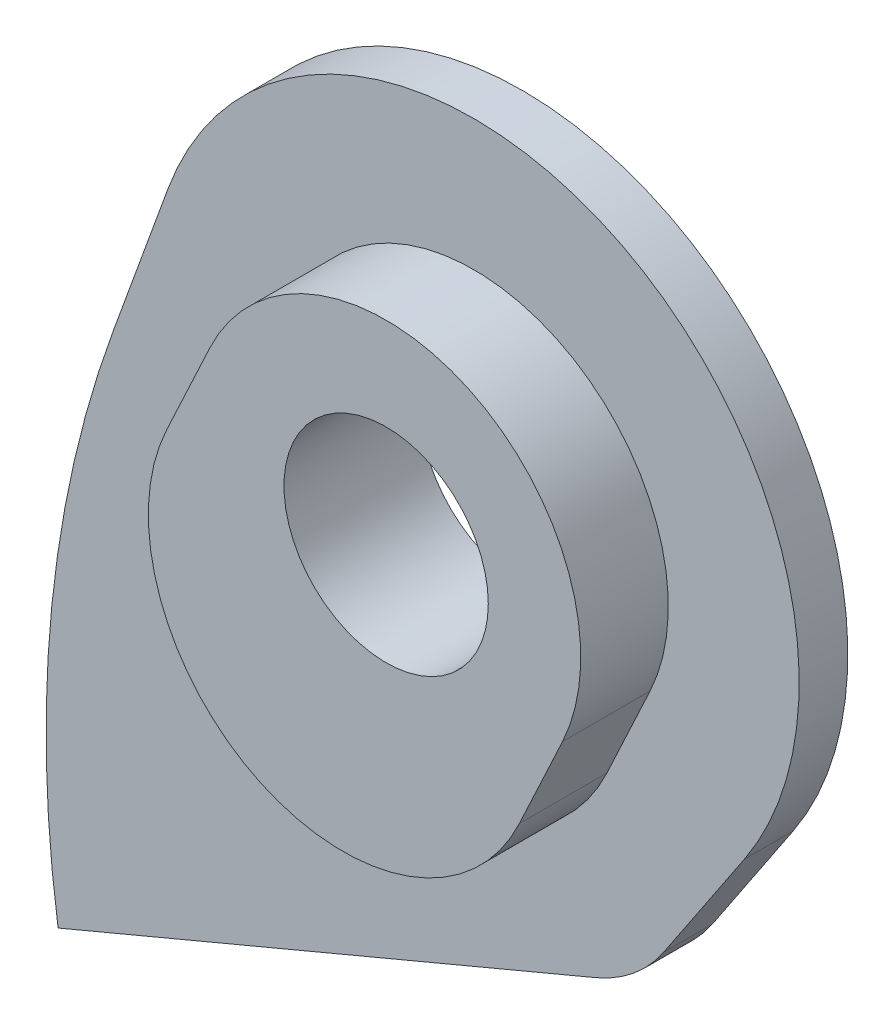
ISO-10303-21;
HEADER;
FILE_DESCRIPTION(('STEP AP214'),'2;1');
FILE_NAME('part.step','',(''),(''),'','','');
FILE_SCHEMA(('AUTOMOTIVE_DESIGN { 1 0 10303 214 1 1 1 1 }'));
ENDSEC;
DATA;
#1=APPLICATION_CONTEXT('core data for automotive mechanical design processes');
#2=APPLICATION_PROTOCOL_DEFINITION('international standard','automotive_design',2000,#1);
#3=PRODUCT_CONTEXT('',#1,'mechanical');
#4=PRODUCT('Part','Part','',(#3));
#5=PRODUCT_RELATED_PRODUCT_CATEGORY('part','',(#4));
#6=PRODUCT_DEFINITION_FORMATION('','',#4);
#7=PRODUCT_DEFINITION_CONTEXT('part definition',#1,'design');
#8=PRODUCT_DEFINITION('design','',#6,#7);
#9=PRODUCT_DEFINITION_SHAPE('','',#8);
#10=(LENGTH_UNIT() NAMED_UNIT(*) SI_UNIT(.MILLI.,.METRE.));
#11=(NAMED_UNIT(*) PLANE_ANGLE_UNIT() SI_UNIT($,.RADIAN.));
#12=(NAMED_UNIT(*) SI_UNIT($,.STERADIAN.) SOLID_ANGLE_UNIT());
#13=UNCERTAINTY_MEASURE_WITH_UNIT(LENGTH_MEASURE(1.E-05),#10,'distance_accuracy_value','');
#14=(GEOMETRIC_REPRESENTATION_CONTEXT(3) GLOBAL_UNCERTAINTY_ASSIGNED_CONTEXT((#13)) GLOBAL_UNIT_ASSIGNED_CONTEXT((#10,
#11,#12)) REPRESENTATION_CONTEXT('',''));
#15=CARTESIAN_POINT('',(0.,0.,0.));
#16=DIRECTION('',(0.,0.,1.));
#17=DIRECTION('',(1.,0.,0.));
#18=AXIS2_PLACEMENT_3D('',#15,#16,#17);
#19=CARTESIAN_POINT('',(0.11468761398859,80.1325343968941,0.));
#20=DIRECTION('',(0.,0.,1.));
#21=DIRECTION('',(1.,0.,0.));
#22=AXIS2_PLACEMENT_3D('',#19,#20,#21);
#23=PLANE('',#22);
#24=CARTESIAN_POINT('',(14.2795120747355,71.4970986035797,0.));
#25=DIRECTION('',(0.,0.,1.));
#26=DIRECTION('',(1.,0.,0.));
#27=AXIS2_PLACEMENT_3D('',#24,#25,#26);
#28=CIRCLE('',#27,22.9540740082007);
#29=CARTESIAN_POINT('',(-7.29026188774433,79.3478542857725,0.));
#30=VERTEX_POINT('',#29);
#31=CARTESIAN_POINT('',(-8.42769677737512,68.1396919078421,0.));
#32=VERTEX_POINT('',#31);
#33=EDGE_CURVE('E154',#30,#32,#28,.T.);
#34=ORIENTED_EDGE('',*,*,#33,.T.);
#35=DIRECTION('',(-0.921960246209325,-0.387284526426812,0.));
#36=VECTOR('',#35,1.);
#37=CARTESIAN_POINT('',(2.62584420432856,72.7829131335289,0.));
#38=LINE('',#37,#36);
#39=CARTESIAN_POINT('',(2.62584420432857,72.7829131335288,0.));
#40=VERTEX_POINT('',#39);
#41=EDGE_CURVE('E178',#40,#32,#38,.T.);
#42=ORIENTED_EDGE('',*,*,#41,.F.);
#43=CARTESIAN_POINT('',(1.41064938117233,75.6757767567832,0.));
#44=DIRECTION('',(0.,0.,-1.));
#45=DIRECTION('',(-1.,0.,0.));
#46=AXIS2_PLACEMENT_3D('',#43,#44,#45);
#47=CIRCLE('',#46,3.13773140994799);
#48=CARTESIAN_POINT('',(4.02035151590427,73.933705240183,0.));
#49=VERTEX_POINT('',#48);
#50=EDGE_CURVE('E173',#49,#40,#47,.T.);
#51=ORIENTED_EDGE('',*,*,#50,.F.);
#52=DIRECTION('',(0.555200968150768,0.831716228628761,0.));
#53=VECTOR('',#52,1.);
#54=CARTESIAN_POINT('',(4.02035151590429,73.933705240183,0.));
#55=LINE('',#54,#53);
#56=CARTESIAN_POINT('',(5.67886918351501,76.4182399199654,0.));
#57=VERTEX_POINT('',#56);
#58=EDGE_CURVE('E147',#49,#57,#55,.T.);
#59=ORIENTED_EDGE('',*,*,#58,.T.);
#60=CARTESIAN_POINT('',(0.11468761398859,80.1325343968941,0.));
#61=DIRECTION('',(0.,0.,1.));
#62=DIRECTION('',(1.,0.,0.));
#63=AXIS2_PLACEMENT_3D('',#60,#61,#62);
#64=CIRCLE('',#63,6.69000000000006);
#65=CARTESIAN_POINT('',(-6.17185601906935,82.4206491557424,0.));
#66=VERTEX_POINT('',#65);
#67=EDGE_CURVE('E149',#57,#66,#64,.T.);
#68=ORIENTED_EDGE('',*,*,#67,.T.);
#69=DIRECTION('',(-0.342020143325666,-0.939692620785909,0.));
#70=VECTOR('',#69,1.);
#71=CARTESIAN_POINT('',(-6.1718560190694,82.4206491557424,0.));
#72=LINE('',#71,#70);
#73=EDGE_CURVE('E155',#66,#30,#72,.T.);
#74=ORIENTED_EDGE('',*,*,#73,.T.);
#75=EDGE_LOOP('',(#34,#42,#51,#59,#68,#74));
#76=FACE_BOUND('',#75,.T.);
#77=DIRECTION('',(-0.4226182617407,-0.90630778703665,0.));
#78=VECTOR('',#77,1.);
#79=CARTESIAN_POINT('',(-3.51054353415801,81.8230074438569,0.));
#80=LINE('',#79,#78);
#81=CARTESIAN_POINT('',(-3.51054353415801,81.8230074438569,0.));
#82=VERTEX_POINT('',#81);
#83=CARTESIAN_POINT('',(-4.39804188381347,79.9197610910799,0.));
#84=VERTEX_POINT('',#83);
#85=EDGE_CURVE('E241',#82,#84,#80,.T.);
#86=ORIENTED_EDGE('',*,*,#85,.F.);
#87=CARTESIAN_POINT('',(0.114687613988609,80.1325343968941,0.));
#88=DIRECTION('',(0.,0.,1.));
#89=DIRECTION('',(1.,0.,0.));
#90=AXIS2_PLACEMENT_3D('',#87,#88,#89);
#91=CIRCLE('',#90,4.00000000000001);
#92=CARTESIAN_POINT('',(3.73991876213519,78.4420613499313,0.));
#93=VERTEX_POINT('',#92);
#94=EDGE_CURVE('E145',#93,#82,#91,.T.);
#95=ORIENTED_EDGE('',*,*,#94,.F.);
#96=DIRECTION('',(0.4226182617407,0.90630778703665,0.));
#97=VECTOR('',#96,1.);
#98=CARTESIAN_POINT('',(3.73991876213519,78.4420613499313,0.));
#99=LINE('',#98,#97);
#100=CARTESIAN_POINT('',(2.85242041247973,76.5388149971543,0.));
#101=VERTEX_POINT('',#100);
#102=EDGE_CURVE('E141',#101,#93,#99,.T.);
#103=ORIENTED_EDGE('',*,*,#102,.F.);
#104=CARTESIAN_POINT('',(-0.772810735666862,78.2292880441171,0.));
#105=DIRECTION('',(0.,0.,1.));
#106=DIRECTION('',(1.,0.,0.));
#107=AXIS2_PLACEMENT_3D('',#104,#105,#106);
#108=CIRCLE('',#107,4.00000000000001);
#109=EDGE_CURVE('E243',#84,#101,#108,.T.);
#110=ORIENTED_EDGE('',*,*,#109,.F.);
#111=EDGE_LOOP('',(#86,#95,#103,#110));
#112=FACE_BOUND('',#111,.T.);
#113=ADVANCED_FACE('F33',(#76,#112),#23,.T.);
#114=CARTESIAN_POINT('',(-8.01359795678153,76.9658058271043,-4.));
#115=DIRECTION('',(-0.921960246209324,-0.387284526426815,0.));
#116=DIRECTION('',(0.387284526426815,-0.921960246209324,0.));
#117=AXIS2_PLACEMENT_3D('',#114,#115,#116);
#118=PLANE('',#117);
#119=DIRECTION('',(0.387284526426815,-0.921960246209324,0.));
#120=VECTOR('',#119,1.);
#121=CARTESIAN_POINT('',(-8.01359795678153,76.9658058271043,-1.));
#122=LINE('',#121,#120);
#123=CARTESIAN_POINT('',(-8.01359795678153,76.9658058271043,-1.));
#124=VERTEX_POINT('',#123);
#125=CARTESIAN_POINT('',(-4.92424784177968,69.611373108264,-1.));
#126=VERTEX_POINT('',#125);
#127=EDGE_CURVE('E56',#124,#126,#122,.T.);
#128=ORIENTED_EDGE('',*,*,#127,.T.);
#129=DIRECTION('',(0.,0.,1.));
#130=VECTOR('',#129,1.);
#131=CARTESIAN_POINT('',(-4.92424784177968,69.611373108264,-4.));
#132=LINE('',#131,#130);
#133=CARTESIAN_POINT('',(-4.92424784177968,69.611373108264,-4.));
#134=VERTEX_POINT('',#133);
#135=EDGE_CURVE('E166',#134,#126,#132,.T.);
#136=ORIENTED_EDGE('',*,*,#135,.F.);
#137=DIRECTION('',(0.387284526426815,-0.921960246209324,0.));
#138=VECTOR('',#137,1.);
#139=CARTESIAN_POINT('',(-8.01359795678153,76.9658058271043,-4.));
#140=LINE('',#139,#138);
#141=CARTESIAN_POINT('',(-8.01359795678153,76.9658058271043,-4.));
#142=VERTEX_POINT('',#141);
#143=EDGE_CURVE('E164',#142,#134,#140,.T.);
#144=ORIENTED_EDGE('',*,*,#143,.F.);
#145=DIRECTION('',(0.,0.,1.));
#146=VECTOR('',#145,1.);
#147=CARTESIAN_POINT('',(-8.01359795678153,76.9658058271043,-4.));
#148=LINE('',#147,#146);
#149=EDGE_CURVE('E170',#142,#124,#148,.T.);
#150=ORIENTED_EDGE('',*,*,#149,.T.);
#151=EDGE_LOOP('',(#128,#136,#144,#150));
#152=FACE_BOUND('',#151,.T.);
#153=ADVANCED_FACE('F230',(#152),#118,.F.);
#154=CARTESIAN_POINT('',(14.2795120747355,71.4970986035797,-4.));
#155=DIRECTION('',(0.,0.,1.));
#156=DIRECTION('',(1.,0.,0.));
#157=AXIS2_PLACEMENT_3D('',#154,#155,#156);
#158=PLANE('',#157);
#159=DIRECTION('',(-0.921960246209326,-0.38728452642681,0.));
#160=VECTOR('',#159,1.);
#161=CARTESIAN_POINT('',(-4.92424784177968,69.611373108264,-4.));
#162=LINE('',#161,#160);
#163=CARTESIAN_POINT('',(-8.42769677737511,68.1396919078421,-4.));
#164=VERTEX_POINT('',#163);
#165=EDGE_CURVE('E159',#134,#164,#162,.T.);
#166=ORIENTED_EDGE('',*,*,#165,.T.);
#167=CARTESIAN_POINT('',(14.2795120747355,71.4970986035797,-4.));
#168=DIRECTION('',(0.,0.,-1.));
#169=DIRECTION('',(1.,0.,0.));
#170=AXIS2_PLACEMENT_3D('',#167,#168,#169);
#171=CIRCLE('',#170,22.9540740082007);
#172=EDGE_CURVE('E162',#164,#142,#171,.T.);
#173=ORIENTED_EDGE('',*,*,#172,.T.);
#174=ORIENTED_EDGE('',*,*,#143,.T.);
#175=EDGE_LOOP('',(#166,#173,#174));
#176=FACE_BOUND('',#175,.T.);
#177=ADVANCED_FACE('F281',(#176),#158,.F.);
#178=CARTESIAN_POINT('',(0.11468761398859,80.1325343968941,-1.));
#179=DIRECTION('',(0.,0.,1.));
#180=DIRECTION('',(1.,0.,0.));
#181=AXIS2_PLACEMENT_3D('',#178,#179,#180);
#182=PLANE('',#181);
#183=CARTESIAN_POINT('',(0.11468761398859,80.1325343968941,-1.));
#184=DIRECTION('',(0.,0.,1.));
#185=DIRECTION('',(1.,0.,0.));
#186=AXIS2_PLACEMENT_3D('',#183,#184,#185);
#187=CIRCLE('',#186,2.10000000000001);
#188=CARTESIAN_POINT('',(2.2146876139886,80.1325343968941,-1.));
#189=VERTEX_POINT('',#188);
#190=EDGE_CURVE('E246',#189,#189,#187,.T.);
#191=ORIENTED_EDGE('',*,*,#190,.T.);
#192=EDGE_LOOP('',(#191));
#193=FACE_BOUND('',#192,.T.);
#194=ORIENTED_EDGE('',*,*,#127,.F.);
#195=CARTESIAN_POINT('',(14.2795120747355,71.4970986035797,-1.));
#196=DIRECTION('',(0.,0.,-1.));
#197=DIRECTION('',(-1.,0.,0.));
#198=AXIS2_PLACEMENT_3D('',#195,#196,#197);
#199=CIRCLE('',#198,22.9540740082007);
#200=CARTESIAN_POINT('',(-7.29026188774433,79.3478542857725,-1.));
#201=VERTEX_POINT('',#200);
#202=EDGE_CURVE('E184',#124,#201,#199,.T.);
#203=ORIENTED_EDGE('',*,*,#202,.T.);
#204=DIRECTION('',(0.342020143325687,0.939692620785902,0.));
#205=VECTOR('',#204,1.);
#206=CARTESIAN_POINT('',(-6.17185601906934,82.4206491557424,-1.));
#207=LINE('',#206,#205);
#208=CARTESIAN_POINT('',(-6.17185601906934,82.4206491557424,-1.));
#209=VERTEX_POINT('',#208);
#210=EDGE_CURVE('E186',#201,#209,#207,.T.);
#211=ORIENTED_EDGE('',*,*,#210,.T.);
#212=CARTESIAN_POINT('',(0.11468761398859,80.1325343968941,-1.));
#213=DIRECTION('',(0.,0.,-1.));
#214=DIRECTION('',(1.,0.,0.));
#215=AXIS2_PLACEMENT_3D('',#212,#213,#214);
#216=CIRCLE('',#215,6.69000000000002);
#217=CARTESIAN_POINT('',(5.67886918351501,76.4182399199654,-1.));
#218=VERTEX_POINT('',#217);
#219=EDGE_CURVE('E174',#209,#218,#216,.T.);
#220=ORIENTED_EDGE('',*,*,#219,.T.);
#221=DIRECTION('',(-0.555200968150769,-0.83171622862876,0.));
#222=VECTOR('',#221,1.);
#223=CARTESIAN_POINT('',(5.67886918351501,76.4182399199654,-1.));
#224=LINE('',#223,#222);
#225=CARTESIAN_POINT('',(4.02035151590429,73.933705240183,-1.));
#226=VERTEX_POINT('',#225);
#227=EDGE_CURVE('E177',#218,#226,#224,.T.);
#228=ORIENTED_EDGE('',*,*,#227,.T.);
#229=CARTESIAN_POINT('',(1.41064938117233,75.6757767567832,-1.));
#230=DIRECTION('',(0.,0.,-1.));
#231=DIRECTION('',(-1.,0.,0.));
#232=AXIS2_PLACEMENT_3D('',#229,#230,#231);
#233=CIRCLE('',#232,3.13773140994799);
#234=CARTESIAN_POINT('',(2.62584420432857,72.7829131335288,-1.));
#235=VERTEX_POINT('',#234);
#236=EDGE_CURVE('E180',#226,#235,#233,.T.);
#237=ORIENTED_EDGE('',*,*,#236,.T.);
#238=DIRECTION('',(-0.921960246209325,-0.387284526426812,0.));
#239=VECTOR('',#238,1.);
#240=CARTESIAN_POINT('',(2.62584420432856,72.7829131335289,-1.));
#241=LINE('',#240,#239);
#242=EDGE_CURVE('E182',#235,#126,#241,.T.);
#243=ORIENTED_EDGE('',*,*,#242,.T.);
#244=EDGE_LOOP('',(#194,#203,#211,#220,#228,#237,#243));
#245=FACE_BOUND('',#244,.T.);
#246=ADVANCED_FACE('F212',(#193,#245),#182,.F.);
#247=CARTESIAN_POINT('',(1.41064938117233,75.6757767567832,-1.));
#248=DIRECTION('',(0.,0.,1.));
#249=DIRECTION('',(1.,0.,0.));
#250=AXIS2_PLACEMENT_3D('',#247,#248,#249);
#251=CYLINDRICAL_SURFACE('',#250,3.13773140994799);
#252=ORIENTED_EDGE('',*,*,#50,.T.);
#253=DIRECTION('',(0.,0.,1.));
#254=VECTOR('',#253,1.);
#255=CARTESIAN_POINT('',(2.62584420432857,72.7829131335288,-1.));
#256=LINE('',#255,#254);
#257=EDGE_CURVE('E196',#235,#40,#256,.T.);
#258=ORIENTED_EDGE('',*,*,#257,.F.);
#259=ORIENTED_EDGE('',*,*,#236,.F.);
#260=DIRECTION('',(0.,0.,1.));
#261=VECTOR('',#260,1.);
#262=CARTESIAN_POINT('',(4.02035151590429,73.933705240183,-1.));
#263=LINE('',#262,#261);
#264=EDGE_CURVE('E199',#226,#49,#263,.T.);
#265=ORIENTED_EDGE('',*,*,#264,.T.);
#266=EDGE_LOOP('',(#252,#258,#259,#265));
#267=FACE_BOUND('',#266,.T.);
#268=ADVANCED_FACE('F223',(#267),#251,.T.);
#269=CARTESIAN_POINT('',(2.62584420432856,72.7829131335289,-1.));
#270=DIRECTION('',(-0.387284526426812,0.921960246209325,0.));
#271=DIRECTION('',(-0.921960246209325,-0.387284526426812,0.));
#272=AXIS2_PLACEMENT_3D('',#269,#270,#271);
#273=PLANE('',#272);
#274=ORIENTED_EDGE('',*,*,#41,.T.);
#275=DIRECTION('',(0.,0.,1.));
#276=VECTOR('',#275,1.);
#277=CARTESIAN_POINT('',(-8.42769677737511,68.1396919078421,-1.));
#278=LINE('',#277,#276);
#279=EDGE_CURVE('E189',#164,#32,#278,.T.);
#280=ORIENTED_EDGE('',*,*,#279,.F.);
#281=ORIENTED_EDGE('',*,*,#165,.F.);
#282=ORIENTED_EDGE('',*,*,#135,.T.);
#283=ORIENTED_EDGE('',*,*,#242,.F.);
#284=ORIENTED_EDGE('',*,*,#257,.T.);
#285=EDGE_LOOP('',(#274,#280,#281,#282,#283,#284));
#286=FACE_BOUND('',#285,.T.);
#287=ADVANCED_FACE('F225',(#286),#273,.F.);
#288=CARTESIAN_POINT('',(14.2795120747355,71.4970986035797,11.));
#289=DIRECTION('',(0.,0.,-1.));
#290=DIRECTION('',(-1.,0.,0.));
#291=AXIS2_PLACEMENT_3D('',#288,#289,#290);
#292=CYLINDRICAL_SURFACE('',#291,22.9540740082007);
#293=ORIENTED_EDGE('',*,*,#33,.F.);
#294=DIRECTION('',(0.,0.,-1.));
#295=VECTOR('',#294,1.);
#296=CARTESIAN_POINT('',(-7.29026188774433,79.3478542857725,11.));
#297=LINE('',#296,#295);
#298=EDGE_CURVE('E202',#30,#201,#297,.T.);
#299=ORIENTED_EDGE('',*,*,#298,.T.);
#300=ORIENTED_EDGE('',*,*,#202,.F.);
#301=ORIENTED_EDGE('',*,*,#149,.F.);
#302=ORIENTED_EDGE('',*,*,#172,.F.);
#303=ORIENTED_EDGE('',*,*,#279,.T.);
#304=EDGE_LOOP('',(#293,#299,#300,#301,#302,#303));
#305=FACE_BOUND('',#304,.T.);
#306=ADVANCED_FACE('F235',(#305),#292,.T.);
#307=CARTESIAN_POINT('',(-6.1718560190694,82.4206491557424,11.));
#308=DIRECTION('',(0.939692620785909,-0.342020143325666,0.));
#309=DIRECTION('',(0.342020143325666,0.939692620785909,0.));
#310=AXIS2_PLACEMENT_3D('',#307,#308,#309);
#311=PLANE('',#310);
#312=ORIENTED_EDGE('',*,*,#73,.F.);
#313=DIRECTION('',(0.,0.,-1.));
#314=VECTOR('',#313,1.);
#315=CARTESIAN_POINT('',(-6.17185601906935,82.4206491557424,11.));
#316=LINE('',#315,#314);
#317=EDGE_CURVE('E41',#66,#209,#316,.T.);
#318=ORIENTED_EDGE('',*,*,#317,.T.);
#319=ORIENTED_EDGE('',*,*,#210,.F.);
#320=ORIENTED_EDGE('',*,*,#298,.F.);
#321=EDGE_LOOP('',(#312,#318,#319,#320));
#322=FACE_BOUND('',#321,.T.);
#323=ADVANCED_FACE('F207',(#322),#311,.F.);
#324=CARTESIAN_POINT('',(0.11468761398859,80.1325343968941,11.));
#325=DIRECTION('',(0.,0.,-1.));
#326=DIRECTION('',(-1.,0.,0.));
#327=AXIS2_PLACEMENT_3D('',#324,#325,#326);
#328=CYLINDRICAL_SURFACE('',#327,6.69000000000006);
#329=ORIENTED_EDGE('',*,*,#317,.F.);
#330=ORIENTED_EDGE('',*,*,#67,.F.);
#331=DIRECTION('',(0.,0.,-1.));
#332=VECTOR('',#331,1.);
#333=CARTESIAN_POINT('',(5.67886918351501,76.4182399199654,11.));
#334=LINE('',#333,#332);
#335=EDGE_CURVE('E11',#57,#218,#334,.T.);
#336=ORIENTED_EDGE('',*,*,#335,.T.);
#337=ORIENTED_EDGE('',*,*,#219,.F.);
#338=EDGE_LOOP('',(#329,#330,#336,#337));
#339=FACE_BOUND('',#338,.T.);
#340=ADVANCED_FACE('F213',(#339),#328,.T.);
#341=CARTESIAN_POINT('',(4.02035151590429,73.933705240183,11.));
#342=DIRECTION('',(-0.831716228628761,0.555200968150768,0.));
#343=DIRECTION('',(-0.555200968150768,-0.831716228628761,0.));
#344=AXIS2_PLACEMENT_3D('',#341,#342,#343);
#345=PLANE('',#344);
#346=ORIENTED_EDGE('',*,*,#58,.F.);
#347=ORIENTED_EDGE('',*,*,#264,.F.);
#348=ORIENTED_EDGE('',*,*,#227,.F.);
#349=ORIENTED_EDGE('',*,*,#335,.F.);
#350=EDGE_LOOP('',(#346,#347,#348,#349));
#351=FACE_BOUND('',#350,.T.);
#352=ADVANCED_FACE('F35',(#351),#345,.F.);
#353=CARTESIAN_POINT('',(0.114687613988609,80.1325343968941,1.8));
#354=DIRECTION('',(0.,0.,-1.));
#355=DIRECTION('',(-1.,0.,0.));
#356=AXIS2_PLACEMENT_3D('',#353,#354,#355);
#357=CYLINDRICAL_SURFACE('',#356,4.00000000000001);
#358=ORIENTED_EDGE('',*,*,#94,.T.);
#359=DIRECTION('',(0.,0.,-1.));
#360=VECTOR('',#359,1.);
#361=CARTESIAN_POINT('',(-3.51054353415801,81.8230074438569,1.8));
#362=LINE('',#361,#360);
#363=CARTESIAN_POINT('',(-3.51054353415801,81.8230074438569,1.8));
#364=VERTEX_POINT('',#363);
#365=EDGE_CURVE('E126',#364,#82,#362,.T.);
#366=ORIENTED_EDGE('',*,*,#365,.F.);
#367=CARTESIAN_POINT('',(0.114687613988609,80.1325343968941,1.8));
#368=DIRECTION('',(0.,0.,1.));
#369=DIRECTION('',(1.,0.,0.));
#370=AXIS2_PLACEMENT_3D('',#367,#368,#369);
#371=CIRCLE('',#370,4.00000000000001);
#372=CARTESIAN_POINT('',(3.73991876213519,78.4420613499313,1.8));
#373=VERTEX_POINT('',#372);
#374=EDGE_CURVE('E133',#373,#364,#371,.T.);
#375=ORIENTED_EDGE('',*,*,#374,.F.);
#376=DIRECTION('',(0.,0.,-1.));
#377=VECTOR('',#376,1.);
#378=CARTESIAN_POINT('',(3.73991876213519,78.4420613499313,1.8));
#379=LINE('',#378,#377);
#380=EDGE_CURVE('E251',#373,#93,#379,.T.);
#381=ORIENTED_EDGE('',*,*,#380,.T.);
#382=EDGE_LOOP('',(#358,#366,#375,#381));
#383=FACE_BOUND('',#382,.T.);
#384=ADVANCED_FACE('F143',(#383),#357,.T.);
#385=CARTESIAN_POINT('',(-3.51054353415801,81.8230074438569,1.8));
#386=DIRECTION('',(0.90630778703665,-0.4226182617407,0.));
#387=DIRECTION('',(0.4226182617407,0.90630778703665,0.));
#388=AXIS2_PLACEMENT_3D('',#385,#386,#387);
#389=PLANE('',#388);
#390=ORIENTED_EDGE('',*,*,#85,.T.);
#391=DIRECTION('',(0.,0.,-1.));
#392=VECTOR('',#391,1.);
#393=CARTESIAN_POINT('',(-4.39804188381347,79.9197610910799,1.8));
#394=LINE('',#393,#392);
#395=CARTESIAN_POINT('',(-4.39804188381347,79.9197610910799,1.8));
#396=VERTEX_POINT('',#395);
#397=EDGE_CURVE('E129',#396,#84,#394,.T.);
#398=ORIENTED_EDGE('',*,*,#397,.F.);
#399=DIRECTION('',(-0.4226182617407,-0.90630778703665,0.));
#400=VECTOR('',#399,1.);
#401=CARTESIAN_POINT('',(-3.51054353415801,81.8230074438569,1.8));
#402=LINE('',#401,#400);
#403=EDGE_CURVE('E122',#364,#396,#402,.T.);
#404=ORIENTED_EDGE('',*,*,#403,.F.);
#405=ORIENTED_EDGE('',*,*,#365,.T.);
#406=EDGE_LOOP('',(#390,#398,#404,#405));
#407=FACE_BOUND('',#406,.T.);
#408=ADVANCED_FACE('F124',(#407),#389,.F.);
#409=CARTESIAN_POINT('',(-0.772810735666862,78.2292880441171,1.8));
#410=DIRECTION('',(0.,0.,-1.));
#411=DIRECTION('',(-1.,0.,0.));
#412=AXIS2_PLACEMENT_3D('',#409,#410,#411);
#413=CYLINDRICAL_SURFACE('',#412,4.00000000000001);
#414=ORIENTED_EDGE('',*,*,#109,.T.);
#415=DIRECTION('',(0.,0.,-1.));
#416=VECTOR('',#415,1.);
#417=CARTESIAN_POINT('',(2.85242041247973,76.5388149971543,1.8));
#418=LINE('',#417,#416);
#419=CARTESIAN_POINT('',(2.85242041247973,76.5388149971543,1.8));
#420=VERTEX_POINT('',#419);
#421=EDGE_CURVE('E48',#420,#101,#418,.T.);
#422=ORIENTED_EDGE('',*,*,#421,.F.);
#423=CARTESIAN_POINT('',(-0.772810735666862,78.2292880441171,1.8));
#424=DIRECTION('',(0.,0.,1.));
#425=DIRECTION('',(1.,0.,0.));
#426=AXIS2_PLACEMENT_3D('',#423,#424,#425);
#427=CIRCLE('',#426,4.00000000000001);
#428=EDGE_CURVE('E132',#396,#420,#427,.T.);
#429=ORIENTED_EDGE('',*,*,#428,.F.);
#430=ORIENTED_EDGE('',*,*,#397,.T.);
#431=EDGE_LOOP('',(#414,#422,#429,#430));
#432=FACE_BOUND('',#431,.T.);
#433=ADVANCED_FACE('F271',(#432),#413,.T.);
#434=CARTESIAN_POINT('',(3.73991876213519,78.4420613499313,1.8));
#435=DIRECTION('',(-0.90630778703665,0.4226182617407,0.));
#436=DIRECTION('',(-0.4226182617407,-0.90630778703665,0.));
#437=AXIS2_PLACEMENT_3D('',#434,#435,#436);
#438=PLANE('',#437);
#439=ORIENTED_EDGE('',*,*,#102,.T.);
#440=ORIENTED_EDGE('',*,*,#380,.F.);
#441=DIRECTION('',(0.4226182617407,0.90630778703665,0.));
#442=VECTOR('',#441,1.);
#443=CARTESIAN_POINT('',(3.73991876213519,78.4420613499313,1.8));
#444=LINE('',#443,#442);
#445=EDGE_CURVE('E137',#420,#373,#444,.T.);
#446=ORIENTED_EDGE('',*,*,#445,.F.);
#447=ORIENTED_EDGE('',*,*,#421,.T.);
#448=EDGE_LOOP('',(#439,#440,#446,#447));
#449=FACE_BOUND('',#448,.T.);
#450=ADVANCED_FACE('F264',(#449),#438,.F.);
#451=CARTESIAN_POINT('',(0.114687613988609,80.1325343968941,1.8));
#452=DIRECTION('',(0.,0.,1.));
#453=DIRECTION('',(1.,0.,0.));
#454=AXIS2_PLACEMENT_3D('',#451,#452,#453);
#455=PLANE('',#454);
#456=CARTESIAN_POINT('',(0.11468761398859,80.1325343968941,1.8));
#457=DIRECTION('',(0.,0.,1.));
#458=DIRECTION('',(1.,0.,0.));
#459=AXIS2_PLACEMENT_3D('',#456,#457,#458);
#460=CIRCLE('',#459,2.10000000000001);
#461=CARTESIAN_POINT('',(2.2146876139886,80.1325343968941,1.8));
#462=VERTEX_POINT('',#461);
#463=EDGE_CURVE('E256',#462,#462,#460,.T.);
#464=ORIENTED_EDGE('',*,*,#463,.F.);
#465=EDGE_LOOP('',(#464));
#466=FACE_BOUND('',#465,.T.);
#467=ORIENTED_EDGE('',*,*,#374,.T.);
#468=ORIENTED_EDGE('',*,*,#403,.T.);
#469=ORIENTED_EDGE('',*,*,#428,.T.);
#470=ORIENTED_EDGE('',*,*,#445,.T.);
#471=EDGE_LOOP('',(#467,#468,#469,#470));
#472=FACE_BOUND('',#471,.T.);
#473=ADVANCED_FACE('F136',(#466,#472),#455,.T.);
#474=CARTESIAN_POINT('',(0.11468761398859,80.1325343968941,-4.));
#475=DIRECTION('',(0.,0.,1.));
#476=DIRECTION('',(1.,0.,0.));
#477=AXIS2_PLACEMENT_3D('',#474,#475,#476);
#478=CYLINDRICAL_SURFACE('',#477,2.10000000000001);
#479=ORIENTED_EDGE('',*,*,#463,.T.);
#480=EDGE_LOOP('',(#479));
#481=FACE_BOUND('',#480,.T.);
#482=ORIENTED_EDGE('',*,*,#190,.F.);
#483=EDGE_LOOP('',(#482));
#484=FACE_BOUND('',#483,.T.);
#485=ADVANCED_FACE('F260',(#481,#484),#478,.F.);
#486=CLOSED_SHELL('',(#113,#153,#177,#246,#268,#287,#306,#323,#340,#352,#384,#408,#433,#450,
#473,#485));
#487=MANIFOLD_SOLID_BREP('B2',#486);
#488=ADVANCED_BREP_SHAPE_REPRESENTATION('',(#18,#487),#14);
#489=SHAPE_DEFINITION_REPRESENTATION(#9,#488);
ENDSEC;
END-ISO-10303-21;
